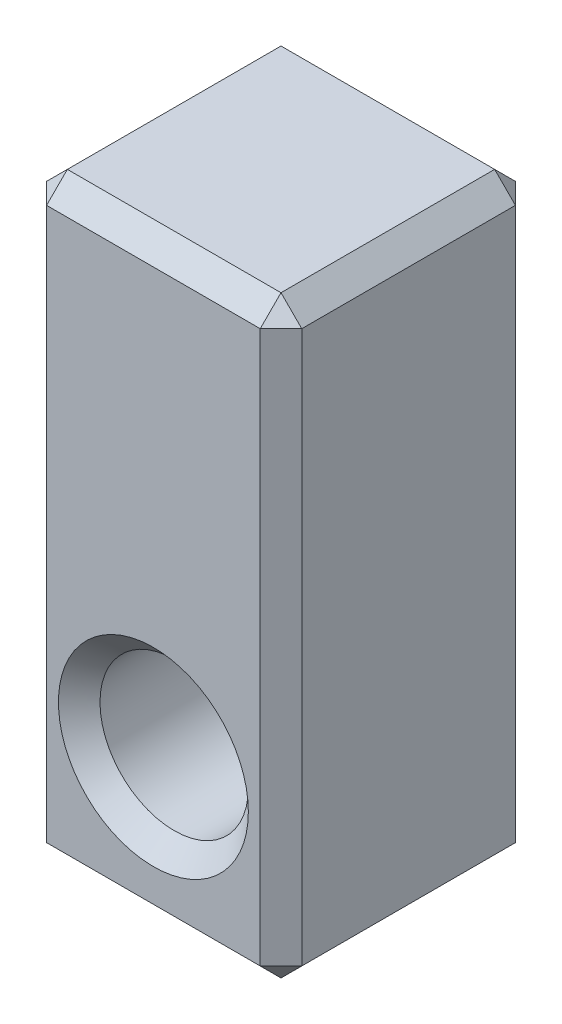
ISO-10303-21;
HEADER;
FILE_DESCRIPTION(('STEP AP214'),'2;1');
FILE_NAME('part.step','',(''),(''),'','','');
FILE_SCHEMA(('AUTOMOTIVE_DESIGN { 1 0 10303 214 1 1 1 1 }'));
ENDSEC;
DATA;
#1=APPLICATION_CONTEXT('core data for automotive mechanical design processes');
#2=APPLICATION_PROTOCOL_DEFINITION('international standard','automotive_design',2000,#1);
#3=PRODUCT_CONTEXT('',#1,'mechanical');
#4=PRODUCT('Part','Part','',(#3));
#5=PRODUCT_RELATED_PRODUCT_CATEGORY('part','',(#4));
#6=PRODUCT_DEFINITION_FORMATION('','',#4);
#7=PRODUCT_DEFINITION_CONTEXT('part definition',#1,'design');
#8=PRODUCT_DEFINITION('design','',#6,#7);
#9=PRODUCT_DEFINITION_SHAPE('','',#8);
#10=(LENGTH_UNIT() NAMED_UNIT(*) SI_UNIT(.MILLI.,.METRE.));
#11=(NAMED_UNIT(*) PLANE_ANGLE_UNIT() SI_UNIT($,.RADIAN.));
#12=(NAMED_UNIT(*) SI_UNIT($,.STERADIAN.) SOLID_ANGLE_UNIT());
#13=UNCERTAINTY_MEASURE_WITH_UNIT(LENGTH_MEASURE(1.E-05),#10,'distance_accuracy_value','');
#14=(GEOMETRIC_REPRESENTATION_CONTEXT(3) GLOBAL_UNCERTAINTY_ASSIGNED_CONTEXT((#13)) GLOBAL_UNIT_ASSIGNED_CONTEXT((#10,
#11,#12)) REPRESENTATION_CONTEXT('',''));
#15=CARTESIAN_POINT('',(0.,0.,0.));
#16=DIRECTION('',(0.,0.,1.));
#17=DIRECTION('',(1.,0.,0.));
#18=AXIS2_PLACEMENT_3D('',#15,#16,#17);
#19=CARTESIAN_POINT('',(-19.7305283018868,50.8,-21.306945754717));
#20=DIRECTION('',(0.,0.,1.));
#21=DIRECTION('',(1.,0.,0.));
#22=AXIS2_PLACEMENT_3D('',#19,#20,#21);
#23=PLANE('',#22);
#24=CARTESIAN_POINT('',(-30.6525283018868,12.7,-21.306945754717));
#25=DIRECTION('',(0.,0.,1.));
#26=DIRECTION('',(1.,0.,0.));
#27=AXIS2_PLACEMENT_3D('',#24,#25,#26);
#28=CIRCLE('',#27,8.128);
#29=CARTESIAN_POINT('',(-22.5245283018868,12.7,-21.306945754717));
#30=VERTEX_POINT('',#29);
#31=EDGE_CURVE('E191',#30,#30,#28,.T.);
#32=ORIENTED_EDGE('',*,*,#31,.T.);
#33=EDGE_LOOP('',(#32));
#34=FACE_BOUND('',#33,.T.);
#35=DIRECTION('',(0.,-1.,0.));
#36=VECTOR('',#35,1.);
#37=CARTESIAN_POINT('',(-21.5085283018868,50.8,-21.306945754717));
#38=LINE('',#37,#36);
#39=CARTESIAN_POINT('',(-21.5085283018868,49.022,-21.306945754717));
#40=VERTEX_POINT('',#39);
#41=CARTESIAN_POINT('',(-21.5085283018868,1.778,-21.306945754717));
#42=VERTEX_POINT('',#41);
#43=EDGE_CURVE('E184',#40,#42,#38,.T.);
#44=ORIENTED_EDGE('',*,*,#43,.T.);
#45=DIRECTION('',(-1.,0.,0.));
#46=VECTOR('',#45,1.);
#47=CARTESIAN_POINT('',(-19.7305283018868,1.778,-21.306945754717));
#48=LINE('',#47,#46);
#49=CARTESIAN_POINT('',(-39.7965283018868,1.778,-21.306945754717));
#50=VERTEX_POINT('',#49);
#51=EDGE_CURVE('E187',#42,#50,#48,.T.);
#52=ORIENTED_EDGE('',*,*,#51,.T.);
#53=DIRECTION('',(0.,1.,0.));
#54=VECTOR('',#53,1.);
#55=CARTESIAN_POINT('',(-39.7965283018868,50.8,-21.306945754717));
#56=LINE('',#55,#54);
#57=CARTESIAN_POINT('',(-39.7965283018868,49.022,-21.306945754717));
#58=VERTEX_POINT('',#57);
#59=EDGE_CURVE('E174',#50,#58,#56,.T.);
#60=ORIENTED_EDGE('',*,*,#59,.T.);
#61=DIRECTION('',(1.,0.,0.));
#62=VECTOR('',#61,1.);
#63=CARTESIAN_POINT('',(-19.7305283018868,49.022,-21.306945754717));
#64=LINE('',#63,#62);
#65=EDGE_CURVE('E181',#58,#40,#64,.T.);
#66=ORIENTED_EDGE('',*,*,#65,.T.);
#67=EDGE_LOOP('',(#44,#52,#60,#66));
#68=FACE_BOUND('',#67,.T.);
#69=ADVANCED_FACE('F41',(#34,#68),#23,.F.);
#70=CARTESIAN_POINT('',(-41.5745283018868,50.8,-21.306945754717));
#71=DIRECTION('',(1.,0.,0.));
#72=DIRECTION('',(0.,0.,-1.));
#73=AXIS2_PLACEMENT_3D('',#70,#71,#72);
#74=PLANE('',#73);
#75=DIRECTION('',(0.,-1.,0.));
#76=VECTOR('',#75,1.);
#77=CARTESIAN_POINT('',(-41.5745283018868,50.8,-19.528945754717));
#78=LINE('',#77,#76);
#79=CARTESIAN_POINT('',(-41.5745283018868,49.022,-19.528945754717));
#80=VERTEX_POINT('',#79);
#81=CARTESIAN_POINT('',(-41.5745283018868,1.77799999999999,-19.528945754717));
#82=VERTEX_POINT('',#81);
#83=EDGE_CURVE('E232',#80,#82,#78,.T.);
#84=ORIENTED_EDGE('',*,*,#83,.T.);
#85=DIRECTION('',(0.,0.,1.));
#86=VECTOR('',#85,1.);
#87=CARTESIAN_POINT('',(-41.5745283018868,1.77799999999999,-21.306945754717));
#88=LINE('',#87,#86);
#89=CARTESIAN_POINT('',(-41.5745283018868,1.77799999999999,-1.24094575471698));
#90=VERTEX_POINT('',#89);
#91=EDGE_CURVE('E11',#82,#90,#88,.T.);
#92=ORIENTED_EDGE('',*,*,#91,.T.);
#93=DIRECTION('',(0.,1.,0.));
#94=VECTOR('',#93,1.);
#95=CARTESIAN_POINT('',(-41.5745283018868,50.8,-1.24094575471698));
#96=LINE('',#95,#94);
#97=CARTESIAN_POINT('',(-41.5745283018868,49.022,-1.24094575471698));
#98=VERTEX_POINT('',#97);
#99=EDGE_CURVE('E52',#90,#98,#96,.T.);
#100=ORIENTED_EDGE('',*,*,#99,.T.);
#101=DIRECTION('',(0.,0.,-1.));
#102=VECTOR('',#101,1.);
#103=CARTESIAN_POINT('',(-41.5745283018868,49.022,-21.306945754717));
#104=LINE('',#103,#102);
#105=EDGE_CURVE('E235',#98,#80,#104,.T.);
#106=ORIENTED_EDGE('',*,*,#105,.T.);
#107=EDGE_LOOP('',(#84,#92,#100,#106));
#108=FACE_BOUND('',#107,.T.);
#109=ADVANCED_FACE('F362',(#108),#74,.F.);
#110=CARTESIAN_POINT('',(-41.5745283018868,50.8,0.537054245283015));
#111=DIRECTION('',(0.,0.,-1.));
#112=DIRECTION('',(-1.,0.,0.));
#113=AXIS2_PLACEMENT_3D('',#110,#111,#112);
#114=PLANE('',#113);
#115=CARTESIAN_POINT('',(-30.6525283018868,12.7,0.537054245283015));
#116=DIRECTION('',(0.,0.,-1.));
#117=DIRECTION('',(-1.,0.,0.));
#118=AXIS2_PLACEMENT_3D('',#115,#116,#117);
#119=CIRCLE('',#118,8.12799999999999);
#120=CARTESIAN_POINT('',(-22.5245283018868,12.7,0.537054245283015));
#121=VERTEX_POINT('',#120);
#122=EDGE_CURVE('E169',#121,#121,#119,.T.);
#123=ORIENTED_EDGE('',*,*,#122,.T.);
#124=EDGE_LOOP('',(#123));
#125=FACE_BOUND('',#124,.T.);
#126=DIRECTION('',(0.,1.,0.));
#127=VECTOR('',#126,1.);
#128=CARTESIAN_POINT('',(-21.5085283018868,50.8,0.537054245283015));
#129=LINE('',#128,#127);
#130=CARTESIAN_POINT('',(-21.5085283018868,1.77799999999999,0.537054245283015));
#131=VERTEX_POINT('',#130);
#132=CARTESIAN_POINT('',(-21.5085283018868,49.022,0.537054245283015));
#133=VERTEX_POINT('',#132);
#134=EDGE_CURVE('E166',#131,#133,#129,.T.);
#135=ORIENTED_EDGE('',*,*,#134,.T.);
#136=DIRECTION('',(-1.,0.,0.));
#137=VECTOR('',#136,1.);
#138=CARTESIAN_POINT('',(-41.5745283018868,49.022,0.537054245283015));
#139=LINE('',#138,#137);
#140=CARTESIAN_POINT('',(-39.7965283018868,49.022,0.537054245283015));
#141=VERTEX_POINT('',#140);
#142=EDGE_CURVE('E137',#133,#141,#139,.T.);
#143=ORIENTED_EDGE('',*,*,#142,.T.);
#144=DIRECTION('',(0.,-1.,0.));
#145=VECTOR('',#144,1.);
#146=CARTESIAN_POINT('',(-39.7965283018868,50.8,0.537054245283015));
#147=LINE('',#146,#145);
#148=CARTESIAN_POINT('',(-39.7965283018868,1.77799999999999,0.537054245283015));
#149=VERTEX_POINT('',#148);
#150=EDGE_CURVE('E155',#141,#149,#147,.T.);
#151=ORIENTED_EDGE('',*,*,#150,.T.);
#152=DIRECTION('',(1.,0.,0.));
#153=VECTOR('',#152,1.);
#154=CARTESIAN_POINT('',(-41.5745283018868,1.77799999999999,0.537054245283015));
#155=LINE('',#154,#153);
#156=EDGE_CURVE('E161',#149,#131,#155,.T.);
#157=ORIENTED_EDGE('',*,*,#156,.T.);
#158=EDGE_LOOP('',(#135,#143,#151,#157));
#159=FACE_BOUND('',#158,.T.);
#160=ADVANCED_FACE('F164',(#125,#159),#114,.F.);
#161=CARTESIAN_POINT('',(-19.7305283018868,50.8,0.537054245283015));
#162=DIRECTION('',(-1.,0.,0.));
#163=DIRECTION('',(0.,0.,1.));
#164=AXIS2_PLACEMENT_3D('',#161,#162,#163);
#165=PLANE('',#164);
#166=DIRECTION('',(0.,1.,0.));
#167=VECTOR('',#166,1.);
#168=CARTESIAN_POINT('',(-19.7305283018868,50.8,-19.528945754717));
#169=LINE('',#168,#167);
#170=CARTESIAN_POINT('',(-19.7305283018868,1.77799999999999,-19.528945754717));
#171=VERTEX_POINT('',#170);
#172=CARTESIAN_POINT('',(-19.7305283018868,49.022,-19.528945754717));
#173=VERTEX_POINT('',#172);
#174=EDGE_CURVE('E206',#171,#173,#169,.T.);
#175=ORIENTED_EDGE('',*,*,#174,.T.);
#176=DIRECTION('',(0.,0.,1.));
#177=VECTOR('',#176,1.);
#178=CARTESIAN_POINT('',(-19.7305283018868,49.022,0.537054245283015));
#179=LINE('',#178,#177);
#180=CARTESIAN_POINT('',(-19.7305283018868,49.022,-1.24094575471698));
#181=VERTEX_POINT('',#180);
#182=EDGE_CURVE('E215',#173,#181,#179,.T.);
#183=ORIENTED_EDGE('',*,*,#182,.T.);
#184=DIRECTION('',(0.,-1.,0.));
#185=VECTOR('',#184,1.);
#186=CARTESIAN_POINT('',(-19.7305283018868,50.8,-1.24094575471698));
#187=LINE('',#186,#185);
#188=CARTESIAN_POINT('',(-19.7305283018868,1.77799999999999,-1.24094575471698));
#189=VERTEX_POINT('',#188);
#190=EDGE_CURVE('E212',#181,#189,#187,.T.);
#191=ORIENTED_EDGE('',*,*,#190,.T.);
#192=DIRECTION('',(0.,0.,-1.));
#193=VECTOR('',#192,1.);
#194=CARTESIAN_POINT('',(-19.7305283018868,1.77799999999999,0.537054245283015));
#195=LINE('',#194,#193);
#196=EDGE_CURVE('E209',#189,#171,#195,.T.);
#197=ORIENTED_EDGE('',*,*,#196,.T.);
#198=EDGE_LOOP('',(#175,#183,#191,#197));
#199=FACE_BOUND('',#198,.T.);
#200=ADVANCED_FACE('F545',(#199),#165,.F.);
#201=CARTESIAN_POINT('',(0.,50.8,0.));
#202=DIRECTION('',(0.,1.,0.));
#203=DIRECTION('',(0.,0.,1.));
#204=AXIS2_PLACEMENT_3D('',#201,#202,#203);
#205=PLANE('',#204);
#206=DIRECTION('',(0.,0.,1.));
#207=VECTOR('',#206,1.);
#208=CARTESIAN_POINT('',(-39.7965283018868,50.8,0.537054245283015));
#209=LINE('',#208,#207);
#210=CARTESIAN_POINT('',(-39.7965283018868,50.8,-19.528945754717));
#211=VERTEX_POINT('',#210);
#212=CARTESIAN_POINT('',(-39.7965283018868,50.8,-1.24094575471698));
#213=VERTEX_POINT('',#212);
#214=EDGE_CURVE('E195',#211,#213,#209,.T.);
#215=ORIENTED_EDGE('',*,*,#214,.T.);
#216=DIRECTION('',(1.,0.,0.));
#217=VECTOR('',#216,1.);
#218=CARTESIAN_POINT('',(-19.7305283018868,50.8,-1.24094575471698));
#219=LINE('',#218,#217);
#220=CARTESIAN_POINT('',(-21.5085283018868,50.8,-1.24094575471698));
#221=VERTEX_POINT('',#220);
#222=EDGE_CURVE('E140',#213,#221,#219,.T.);
#223=ORIENTED_EDGE('',*,*,#222,.T.);
#224=DIRECTION('',(0.,0.,-1.));
#225=VECTOR('',#224,1.);
#226=CARTESIAN_POINT('',(-21.5085283018868,50.8,-21.306945754717));
#227=LINE('',#226,#225);
#228=CARTESIAN_POINT('',(-21.5085283018868,50.8,-19.528945754717));
#229=VERTEX_POINT('',#228);
#230=EDGE_CURVE('E201',#221,#229,#227,.T.);
#231=ORIENTED_EDGE('',*,*,#230,.T.);
#232=DIRECTION('',(-1.,0.,0.));
#233=VECTOR('',#232,1.);
#234=CARTESIAN_POINT('',(-41.5745283018868,50.8,-19.528945754717));
#235=LINE('',#234,#233);
#236=EDGE_CURVE('E198',#229,#211,#235,.T.);
#237=ORIENTED_EDGE('',*,*,#236,.T.);
#238=EDGE_LOOP('',(#215,#223,#231,#237));
#239=FACE_BOUND('',#238,.T.);
#240=ADVANCED_FACE('F355',(#239),#205,.T.);
#241=CARTESIAN_POINT('',(0.,0.,0.));
#242=DIRECTION('',(0.,1.,0.));
#243=DIRECTION('',(0.,0.,1.));
#244=AXIS2_PLACEMENT_3D('',#241,#242,#243);
#245=PLANE('',#244);
#246=DIRECTION('',(0.,0.,-1.));
#247=VECTOR('',#246,1.);
#248=CARTESIAN_POINT('',(-39.7965283018868,0.,0.));
#249=LINE('',#248,#247);
#250=CARTESIAN_POINT('',(-39.7965283018868,0.,-1.24094575471699));
#251=VERTEX_POINT('',#250);
#252=CARTESIAN_POINT('',(-39.7965283018868,0.,-19.528945754717));
#253=VERTEX_POINT('',#252);
#254=EDGE_CURVE('E225',#251,#253,#249,.T.);
#255=ORIENTED_EDGE('',*,*,#254,.T.);
#256=DIRECTION('',(1.,0.,0.));
#257=VECTOR('',#256,1.);
#258=CARTESIAN_POINT('',(0.,0.,-19.528945754717));
#259=LINE('',#258,#257);
#260=CARTESIAN_POINT('',(-21.5085283018868,0.,-19.528945754717));
#261=VERTEX_POINT('',#260);
#262=EDGE_CURVE('E228',#253,#261,#259,.T.);
#263=ORIENTED_EDGE('',*,*,#262,.T.);
#264=DIRECTION('',(0.,0.,1.));
#265=VECTOR('',#264,1.);
#266=CARTESIAN_POINT('',(-21.5085283018868,0.,0.));
#267=LINE('',#266,#265);
#268=CARTESIAN_POINT('',(-21.5085283018868,0.,-1.24094575471699));
#269=VERTEX_POINT('',#268);
#270=EDGE_CURVE('E219',#261,#269,#267,.T.);
#271=ORIENTED_EDGE('',*,*,#270,.T.);
#272=DIRECTION('',(-1.,0.,0.));
#273=VECTOR('',#272,1.);
#274=CARTESIAN_POINT('',(0.,0.,-1.24094575471699));
#275=LINE('',#274,#273);
#276=EDGE_CURVE('E222',#269,#251,#275,.T.);
#277=ORIENTED_EDGE('',*,*,#276,.T.);
#278=EDGE_LOOP('',(#255,#263,#271,#277));
#279=FACE_BOUND('',#278,.T.);
#280=ADVANCED_FACE('F385',(#279),#245,.F.);
#281=CARTESIAN_POINT('',(-30.6525283018868,12.7,-21.306945754717));
#282=DIRECTION('',(0.,0.,1.));
#283=DIRECTION('',(1.,0.,0.));
#284=AXIS2_PLACEMENT_3D('',#281,#282,#283);
#285=CYLINDRICAL_SURFACE('',#284,6.35);
#286=CARTESIAN_POINT('',(-30.6525283018868,12.7,-1.24094575471697));
#287=DIRECTION('',(0.,0.,-1.));
#288=DIRECTION('',(-1.,0.,0.));
#289=AXIS2_PLACEMENT_3D('',#286,#287,#288);
#290=CIRCLE('',#289,6.35);
#291=CARTESIAN_POINT('',(-24.3025283018868,12.7,-1.24094575471697));
#292=VERTEX_POINT('',#291);
#293=EDGE_CURVE('E162',#292,#292,#290,.F.);
#294=ORIENTED_EDGE('',*,*,#293,.T.);
#295=EDGE_LOOP('',(#294));
#296=FACE_BOUND('',#295,.T.);
#297=CARTESIAN_POINT('',(-30.6525283018868,12.7,-19.528945754717));
#298=DIRECTION('',(0.,0.,1.));
#299=DIRECTION('',(1.,0.,0.));
#300=AXIS2_PLACEMENT_3D('',#297,#298,#299);
#301=CIRCLE('',#300,6.35);
#302=CARTESIAN_POINT('',(-24.3025283018868,12.7,-19.528945754717));
#303=VERTEX_POINT('',#302);
#304=EDGE_CURVE('E319',#303,#303,#301,.F.);
#305=ORIENTED_EDGE('',*,*,#304,.T.);
#306=EDGE_LOOP('',(#305));
#307=FACE_BOUND('',#306,.T.);
#308=ADVANCED_FACE('F421',(#296,#307),#285,.F.);
#309=CARTESIAN_POINT('',(-30.6525283018868,12.7,-1.24094575471697));
#310=DIRECTION('',(0.,0.,1.));
#311=DIRECTION('',(1.,0.,0.));
#312=AXIS2_PLACEMENT_3D('',#309,#310,#311);
#313=CONICAL_SURFACE('',#312,6.35,0.785398163397448);
#314=CARTESIAN_POINT('',(-22.5245283018868,12.7,0.537054245283015));
#315=CARTESIAN_POINT('',(-22.5430491352201,12.7,0.518533411949682));
#316=CARTESIAN_POINT('',(-22.5615699685535,12.7,0.500012578616349));
#317=CARTESIAN_POINT('',(-22.5986116352201,12.7,0.462970911949682));
#318=CARTESIAN_POINT('',(-22.6171324685535,12.7,0.444450078616349));
#319=CARTESIAN_POINT('',(-22.6541741352201,12.7,0.407408411949682));
#320=CARTESIAN_POINT('',(-22.6726949685535,12.7,0.388887578616349));
#321=CARTESIAN_POINT('',(-22.7097366352201,12.7,0.351845911949683));
#322=CARTESIAN_POINT('',(-22.7282574685535,12.7,0.33332507861635));
#323=CARTESIAN_POINT('',(-22.7652991352201,12.7,0.296283411949684));
#324=CARTESIAN_POINT('',(-22.7838199685535,12.7,0.27776257861635));
#325=CARTESIAN_POINT('',(-22.8208616352201,12.7,0.240720911949683));
#326=CARTESIAN_POINT('',(-22.8393824685535,12.7,0.22220007861635));
#327=CARTESIAN_POINT('',(-22.8764241352201,12.7,0.185158411949684));
#328=CARTESIAN_POINT('',(-22.8949449685535,12.7,0.166637578616351));
#329=CARTESIAN_POINT('',(-22.9319866352201,12.7,0.129595911949685));
#330=CARTESIAN_POINT('',(-22.9505074685535,12.7,0.111075078616351));
#331=CARTESIAN_POINT('',(-22.9875491352201,12.7,0.0740334119496846));
#332=CARTESIAN_POINT('',(-23.0060699685535,12.7,0.0555125786163512));
#333=CARTESIAN_POINT('',(-23.0431116352201,12.7,0.0184709119496849));
#334=CARTESIAN_POINT('',(-23.0616324685535,12.7,-4.9921383647878E-05));
#335=CARTESIAN_POINT('',(-23.0986741352201,12.7,-0.0370915880503141));
#336=CARTESIAN_POINT('',(-23.1171949685534,12.7,-0.0556124213836475));
#337=CARTESIAN_POINT('',(-23.1542366352201,12.7,-0.0926540880503143));
#338=CARTESIAN_POINT('',(-23.1727574685534,12.7,-0.111174921383648));
#339=CARTESIAN_POINT('',(-23.2097991352201,12.7,-0.148216588050314));
#340=CARTESIAN_POINT('',(-23.2283199685534,12.7,-0.166737421383647));
#341=CARTESIAN_POINT('',(-23.2653616352201,12.7,-0.203779088050313));
#342=CARTESIAN_POINT('',(-23.2838824685534,12.7,-0.222299921383646));
#343=CARTESIAN_POINT('',(-23.3209241352201,12.7,-0.259341588050313));
#344=CARTESIAN_POINT('',(-23.3394449685534,12.7,-0.277862421383647));
#345=CARTESIAN_POINT('',(-23.3764866352201,12.7,-0.314904088050313));
#346=CARTESIAN_POINT('',(-23.3950074685534,12.7,-0.333424921383646));
#347=CARTESIAN_POINT('',(-23.4320491352201,12.7,-0.370466588050312));
#348=CARTESIAN_POINT('',(-23.4505699685534,12.7,-0.388987421383645));
#349=CARTESIAN_POINT('',(-23.4876116352201,12.7,-0.426029088050312));
#350=CARTESIAN_POINT('',(-23.5061324685534,12.7,-0.444549921383646));
#351=CARTESIAN_POINT('',(-23.5431741352201,12.7,-0.481591588050312));
#352=CARTESIAN_POINT('',(-23.5616949685534,12.7,-0.500112421383645));
#353=CARTESIAN_POINT('',(-23.5987366352201,12.7,-0.537154088050311));
#354=CARTESIAN_POINT('',(-23.6172574685534,12.7,-0.555674921383645));
#355=CARTESIAN_POINT('',(-23.6542991352201,12.7,-0.592716588050311));
#356=CARTESIAN_POINT('',(-23.6728199685534,12.7,-0.611237421383644));
#357=CARTESIAN_POINT('',(-23.7098616352201,12.7,-0.64827908805031));
#358=CARTESIAN_POINT('',(-23.7283824685534,12.7,-0.666799921383644));
#359=CARTESIAN_POINT('',(-23.7654241352201,12.7,-0.70384158805031));
#360=CARTESIAN_POINT('',(-23.7839449685534,12.7,-0.722362421383643));
#361=CARTESIAN_POINT('',(-23.8209866352201,12.7,-0.759404088050309));
#362=CARTESIAN_POINT('',(-23.8395074685534,12.7,-0.777924921383643));
#363=CARTESIAN_POINT('',(-23.8765491352201,12.7,-0.814966588050309));
#364=CARTESIAN_POINT('',(-23.8950699685534,12.7,-0.833487421383643));
#365=CARTESIAN_POINT('',(-23.9321116352201,12.7,-0.870529088050309));
#366=CARTESIAN_POINT('',(-23.9506324685534,12.7,-0.889049921383642));
#367=CARTESIAN_POINT('',(-23.9876741352201,12.7,-0.926091588050308));
#368=CARTESIAN_POINT('',(-24.0061949685534,12.7,-0.944612421383641));
#369=CARTESIAN_POINT('',(-24.0432366352201,12.7,-0.981654088050308));
#370=CARTESIAN_POINT('',(-24.0617574685534,12.7,-1.00017492138364));
#371=CARTESIAN_POINT('',(-24.0987991352201,12.7,-1.03721658805031));
#372=CARTESIAN_POINT('',(-24.1173199685534,12.7,-1.05573742138364));
#373=CARTESIAN_POINT('',(-24.1543616352201,12.7,-1.09277908805031));
#374=CARTESIAN_POINT('',(-24.1728824685534,12.7,-1.11129992138364));
#375=CARTESIAN_POINT('',(-24.2099241352201,12.7,-1.14834158805031));
#376=CARTESIAN_POINT('',(-24.2284449685534,12.7,-1.16686242138364));
#377=CARTESIAN_POINT('',(-24.2654866352201,12.7,-1.20390408805031));
#378=CARTESIAN_POINT('',(-24.2840074685534,12.7,-1.22242492138364));
#379=CARTESIAN_POINT('',(-24.3025283018868,12.7,-1.24094575471697));
#380=B_SPLINE_CURVE_WITH_KNOTS('',3,(#314,#315,#316,#317,#318,#319,#320,#321,#322,#323,#324,
#325,#326,#327,#328,#329,#330,#331,#332,#333,#334,#335,#336,#337,#338,#339,#340,#341,#342,#343,
#344,#345,#346,#347,#348,#349,#350,#351,#352,#353,#354,#355,#356,#357,#358,#359,#360,#361,#362,
#363,#364,#365,#366,#367,#368,#369,#370,#371,#372,#373,#374,#375,#376,#377,#378,#379),
.UNSPECIFIED.,.F.,.F.,(4,2,2,2,2,2,2,2,2,2,2,2,2,2,2,2,2,2,2,2,2,2,2,2,2,2,2,2,2,2,2,2,4),(0.,
0.0785772410593537,0.157154482118707,0.235731723178063,0.314308964237419,0.392886205296771,
0.471463446356127,0.550040687415483,0.628617928474837,0.70719516953419,0.785772410593546,
0.8643496516529,0.942926892712253,1.02150413377161,1.10008137483096,1.17865861589032,
1.25723585694967,1.33581309800903,1.41439033906838,1.49296758012774,1.57154482118709,
1.65012206224645,1.7286993033058,1.80727654436516,1.88585378542451,1.96443102648386,
2.04300826754322,2.12158550860257,2.20016274966193,2.27873999072128,2.35731723178064,
2.43589447283999,2.51447171389935),.UNSPECIFIED.);
#381=EDGE_CURVE('BSEAM414',#121,#292,#380,.T.);
#382=ORIENTED_EDGE('',*,*,#122,.F.);
#383=ORIENTED_EDGE('',*,*,#293,.F.);
#384=ORIENTED_EDGE('',*,*,#381,.T.);
#385=ORIENTED_EDGE('',*,*,#381,.F.);
#386=EDGE_LOOP('',(#382,#384,#383,#385));
#387=FACE_BOUND('',#386,.T.);
#388=ADVANCED_FACE('F414',(#387),#313,.F.);
#389=CARTESIAN_POINT('',(-30.6525283018868,12.7,-21.306945754717));
#390=DIRECTION('',(0.,0.,-1.));
#391=DIRECTION('',(-1.,0.,0.));
#392=AXIS2_PLACEMENT_3D('',#389,#390,#391);
#393=CONICAL_SURFACE('',#392,8.128,0.785398163397446);
#394=ORIENTED_EDGE('',*,*,#304,.F.);
#395=EDGE_LOOP('',(#394));
#396=FACE_BOUND('',#395,.T.);
#397=ORIENTED_EDGE('',*,*,#31,.F.);
#398=EDGE_LOOP('',(#397));
#399=FACE_BOUND('',#398,.T.);
#400=ADVANCED_FACE('F420',(#396,#399),#393,.F.);
#401=CARTESIAN_POINT('',(-19.7305283018868,1.778,-21.306945754717));
#402=DIRECTION('',(0.,0.707106781186546,0.707106781186549));
#403=DIRECTION('',(-1.,0.,0.));
#404=AXIS2_PLACEMENT_3D('',#401,#402,#403);
#405=PLANE('',#404);
#406=DIRECTION('',(0.,0.707106781186549,-0.707106781186546));
#407=VECTOR('',#406,1.);
#408=CARTESIAN_POINT('',(-39.7965283018868,1.778,-21.306945754717));
#409=LINE('',#408,#407);
#410=EDGE_CURVE('E46',#50,#253,#409,.F.);
#411=ORIENTED_EDGE('',*,*,#410,.F.);
#412=ORIENTED_EDGE('',*,*,#51,.F.);
#413=DIRECTION('',(0.,-0.707106781186549,0.707106781186546));
#414=VECTOR('',#413,1.);
#415=CARTESIAN_POINT('',(-21.5085283018868,0.,-19.528945754717));
#416=LINE('',#415,#414);
#417=EDGE_CURVE('E310',#261,#42,#416,.F.);
#418=ORIENTED_EDGE('',*,*,#417,.F.);
#419=ORIENTED_EDGE('',*,*,#262,.F.);
#420=EDGE_LOOP('',(#411,#412,#418,#419));
#421=FACE_BOUND('',#420,.T.);
#422=ADVANCED_FACE('F44',(#421),#405,.F.);
#423=CARTESIAN_POINT('',(-39.7965283018868,1.778,-21.306945754717));
#424=DIRECTION('',(-0.577350269189624,-0.577350269189624,-0.577350269189629));
#425=DIRECTION('',(-0.70710678118655,0.,0.707106781186545));
#426=AXIS2_PLACEMENT_3D('',#423,#424,#425);
#427=PLANE('',#426);
#428=DIRECTION('',(-0.707106781186549,0.,0.707106781186546));
#429=VECTOR('',#428,1.);
#430=CARTESIAN_POINT('',(-39.7965283018868,1.778,-21.306945754717));
#431=LINE('',#430,#429);
#432=EDGE_CURVE('E303',#50,#82,#431,.T.);
#433=ORIENTED_EDGE('',*,*,#432,.F.);
#434=ORIENTED_EDGE('',*,*,#410,.T.);
#435=DIRECTION('',(0.707106781186547,-0.707106781186547,0.));
#436=VECTOR('',#435,1.);
#437=CARTESIAN_POINT('',(-40.6855283018868,0.888999999999997,-19.528945754717));
#438=LINE('',#437,#436);
#439=EDGE_CURVE('E307',#82,#253,#438,.T.);
#440=ORIENTED_EDGE('',*,*,#439,.F.);
#441=EDGE_LOOP('',(#433,#434,#440));
#442=FACE_BOUND('',#441,.T.);
#443=ADVANCED_FACE('F508',(#442),#427,.T.);
#444=CARTESIAN_POINT('',(-21.5085283018868,0.,-19.528945754717));
#445=DIRECTION('',(0.577350269189624,-0.577350269189626,-0.577350269189628));
#446=DIRECTION('',(0.,0.707106781186549,-0.707106781186546));
#447=AXIS2_PLACEMENT_3D('',#444,#445,#446);
#448=PLANE('',#447);
#449=DIRECTION('',(0.707106781186549,0.707106781186546,0.));
#450=VECTOR('',#449,1.);
#451=CARTESIAN_POINT('',(-21.5085283018868,0.,-19.528945754717));
#452=LINE('',#451,#450);
#453=EDGE_CURVE('E295',#261,#171,#452,.T.);
#454=ORIENTED_EDGE('',*,*,#453,.F.);
#455=ORIENTED_EDGE('',*,*,#417,.T.);
#456=DIRECTION('',(-0.707106781186549,0.,-0.707106781186546));
#457=VECTOR('',#456,1.);
#458=CARTESIAN_POINT('',(-20.6195283018868,1.778,-20.417945754717));
#459=LINE('',#458,#457);
#460=EDGE_CURVE('E299',#171,#42,#459,.T.);
#461=ORIENTED_EDGE('',*,*,#460,.F.);
#462=EDGE_LOOP('',(#454,#455,#461));
#463=FACE_BOUND('',#462,.T.);
#464=ADVANCED_FACE('F379',(#463),#448,.T.);
#465=CARTESIAN_POINT('',(-41.5745283018868,1.77799999999999,-21.306945754717));
#466=DIRECTION('',(0.707106781186548,0.707106781186547,0.));
#467=DIRECTION('',(0.,0.,1.));
#468=AXIS2_PLACEMENT_3D('',#465,#466,#467);
#469=PLANE('',#468);
#470=ORIENTED_EDGE('',*,*,#439,.T.);
#471=ORIENTED_EDGE('',*,*,#254,.F.);
#472=DIRECTION('',(-0.707106781186548,0.707106781186548,0.));
#473=VECTOR('',#472,1.);
#474=CARTESIAN_POINT('',(-41.5745283018868,1.77799999999999,-1.24094575471698));
#475=LINE('',#474,#473);
#476=EDGE_CURVE('E287',#90,#251,#475,.F.);
#477=ORIENTED_EDGE('',*,*,#476,.F.);
#478=ORIENTED_EDGE('',*,*,#91,.F.);
#479=EDGE_LOOP('',(#470,#471,#477,#478));
#480=FACE_BOUND('',#479,.T.);
#481=ADVANCED_FACE('F389',(#480),#469,.F.);
#482=CARTESIAN_POINT('',(-41.5745283018868,50.8,-19.528945754717));
#483=DIRECTION('',(0.707106781186546,0.,0.707106781186549));
#484=DIRECTION('',(0.,-1.,0.));
#485=AXIS2_PLACEMENT_3D('',#482,#483,#484);
#486=PLANE('',#485);
#487=ORIENTED_EDGE('',*,*,#432,.T.);
#488=ORIENTED_EDGE('',*,*,#83,.F.);
#489=DIRECTION('',(0.707106781186549,0.,-0.707106781186546));
#490=VECTOR('',#489,1.);
#491=CARTESIAN_POINT('',(-40.6855283018868,49.022,-20.417945754717));
#492=LINE('',#491,#490);
#493=EDGE_CURVE('E283',#58,#80,#492,.F.);
#494=ORIENTED_EDGE('',*,*,#493,.F.);
#495=ORIENTED_EDGE('',*,*,#59,.F.);
#496=EDGE_LOOP('',(#487,#488,#494,#495));
#497=FACE_BOUND('',#496,.T.);
#498=ADVANCED_FACE('F365',(#497),#486,.F.);
#499=CARTESIAN_POINT('',(0.,50.8,-19.528945754717));
#500=DIRECTION('',(0.,0.707106781186546,-0.707106781186549));
#501=DIRECTION('',(1.,0.,0.));
#502=AXIS2_PLACEMENT_3D('',#499,#500,#501);
#503=PLANE('',#502);
#504=DIRECTION('',(0.,0.707106781186549,0.707106781186546));
#505=VECTOR('',#504,1.);
#506=CARTESIAN_POINT('',(-21.5085283018868,50.8,-19.528945754717));
#507=LINE('',#506,#505);
#508=EDGE_CURVE('E275',#40,#229,#507,.T.);
#509=ORIENTED_EDGE('',*,*,#508,.F.);
#510=ORIENTED_EDGE('',*,*,#65,.F.);
#511=DIRECTION('',(0.,-0.707106781186549,-0.707106781186546));
#512=VECTOR('',#511,1.);
#513=CARTESIAN_POINT('',(-39.7965283018868,50.8,-19.528945754717));
#514=LINE('',#513,#512);
#515=EDGE_CURVE('E279',#211,#58,#514,.T.);
#516=ORIENTED_EDGE('',*,*,#515,.F.);
#517=ORIENTED_EDGE('',*,*,#236,.F.);
#518=EDGE_LOOP('',(#509,#510,#516,#517));
#519=FACE_BOUND('',#518,.T.);
#520=ADVANCED_FACE('F371',(#519),#503,.T.);
#521=CARTESIAN_POINT('',(-21.5085283018868,50.8,-21.306945754717));
#522=DIRECTION('',(-0.707106781186546,0.,0.707106781186549));
#523=DIRECTION('',(0.,-1.,0.));
#524=AXIS2_PLACEMENT_3D('',#521,#522,#523);
#525=PLANE('',#524);
#526=ORIENTED_EDGE('',*,*,#460,.T.);
#527=ORIENTED_EDGE('',*,*,#43,.F.);
#528=DIRECTION('',(0.707106781186549,0.,0.707106781186546));
#529=VECTOR('',#528,1.);
#530=CARTESIAN_POINT('',(-20.6195283018868,49.022,-20.417945754717));
#531=LINE('',#530,#529);
#532=EDGE_CURVE('E271',#173,#40,#531,.F.);
#533=ORIENTED_EDGE('',*,*,#532,.F.);
#534=ORIENTED_EDGE('',*,*,#174,.F.);
#535=EDGE_LOOP('',(#526,#527,#533,#534));
#536=FACE_BOUND('',#535,.T.);
#537=ADVANCED_FACE('F377',(#536),#525,.F.);
#538=CARTESIAN_POINT('',(-19.7305283018868,1.77799999999999,0.537054245283015));
#539=DIRECTION('',(-0.707106781186546,0.707106781186549,0.));
#540=DIRECTION('',(0.,0.,-1.));
#541=AXIS2_PLACEMENT_3D('',#538,#539,#540);
#542=PLANE('',#541);
#543=ORIENTED_EDGE('',*,*,#453,.T.);
#544=ORIENTED_EDGE('',*,*,#196,.F.);
#545=DIRECTION('',(-0.707106781186549,-0.707106781186546,0.));
#546=VECTOR('',#545,1.);
#547=CARTESIAN_POINT('',(-19.7305283018868,1.77799999999999,-1.24094575471698));
#548=LINE('',#547,#546);
#549=EDGE_CURVE('E267',#269,#189,#548,.F.);
#550=ORIENTED_EDGE('',*,*,#549,.F.);
#551=ORIENTED_EDGE('',*,*,#270,.F.);
#552=EDGE_LOOP('',(#543,#544,#550,#551));
#553=FACE_BOUND('',#552,.T.);
#554=ADVANCED_FACE('F401',(#553),#542,.F.);
#555=CARTESIAN_POINT('',(-41.5745283018868,1.77799999999999,0.537054245283015));
#556=DIRECTION('',(0.,0.707106781186549,-0.707106781186546));
#557=DIRECTION('',(1.,0.,0.));
#558=AXIS2_PLACEMENT_3D('',#555,#556,#557);
#559=PLANE('',#558);
#560=DIRECTION('',(0.,-0.707106781186546,-0.707106781186549));
#561=VECTOR('',#560,1.);
#562=CARTESIAN_POINT('',(-39.7965283018868,0.888999999999994,-0.351945754716989));
#563=LINE('',#562,#561);
#564=EDGE_CURVE('E291',#251,#149,#563,.F.);
#565=ORIENTED_EDGE('',*,*,#564,.F.);
#566=ORIENTED_EDGE('',*,*,#276,.F.);
#567=DIRECTION('',(0.,0.707106781186546,0.707106781186549));
#568=VECTOR('',#567,1.);
#569=CARTESIAN_POINT('',(-21.5085283018868,0.888999999999997,-0.351945754716986));
#570=LINE('',#569,#568);
#571=EDGE_CURVE('E263',#131,#269,#570,.F.);
#572=ORIENTED_EDGE('',*,*,#571,.F.);
#573=ORIENTED_EDGE('',*,*,#156,.F.);
#574=EDGE_LOOP('',(#565,#566,#572,#573));
#575=FACE_BOUND('',#574,.T.);
#576=ADVANCED_FACE('F338',(#575),#559,.F.);
#577=CARTESIAN_POINT('',(-41.5745283018868,1.77799999999999,-1.24094575471698));
#578=DIRECTION('',(-0.577350269189624,-0.577350269189627,0.577350269189627));
#579=DIRECTION('',(0.,-0.707106781186547,-0.707106781186547));
#580=AXIS2_PLACEMENT_3D('',#577,#578,#579);
#581=PLANE('',#580);
#582=ORIENTED_EDGE('',*,*,#476,.T.);
#583=ORIENTED_EDGE('',*,*,#564,.T.);
#584=DIRECTION('',(0.707106781186549,0.,0.707106781186546));
#585=VECTOR('',#584,1.);
#586=CARTESIAN_POINT('',(-41.5745283018868,1.77799999999999,-1.24094575471698));
#587=LINE('',#586,#585);
#588=EDGE_CURVE('E157',#90,#149,#587,.T.);
#589=ORIENTED_EDGE('',*,*,#588,.F.);
#590=EDGE_LOOP('',(#582,#583,#589));
#591=FACE_BOUND('',#590,.T.);
#592=ADVANCED_FACE('F392',(#591),#581,.T.);
#593=CARTESIAN_POINT('',(-39.7965283018868,50.8,-19.528945754717));
#594=DIRECTION('',(-0.577350269189624,0.577350269189624,-0.577350269189629));
#595=DIRECTION('',(-0.70710678118655,0.,0.707106781186545));
#596=AXIS2_PLACEMENT_3D('',#593,#594,#595);
#597=PLANE('',#596);
#598=ORIENTED_EDGE('',*,*,#515,.T.);
#599=ORIENTED_EDGE('',*,*,#493,.T.);
#600=DIRECTION('',(0.707106781186547,0.707106781186547,0.));
#601=VECTOR('',#600,1.);
#602=CARTESIAN_POINT('',(-39.7965283018868,50.8,-19.528945754717));
#603=LINE('',#602,#601);
#604=EDGE_CURVE('E257',#211,#80,#603,.F.);
#605=ORIENTED_EDGE('',*,*,#604,.F.);
#606=EDGE_LOOP('',(#598,#599,#605));
#607=FACE_BOUND('',#606,.T.);
#608=ADVANCED_FACE('F367',(#607),#597,.T.);
#609=CARTESIAN_POINT('',(-21.5085283018868,50.8,-19.528945754717));
#610=DIRECTION('',(0.577350269189626,0.577350269189624,-0.577350269189628));
#611=DIRECTION('',(-0.707106781186549,0.,-0.707106781186546));
#612=AXIS2_PLACEMENT_3D('',#609,#610,#611);
#613=PLANE('',#612);
#614=ORIENTED_EDGE('',*,*,#532,.T.);
#615=ORIENTED_EDGE('',*,*,#508,.T.);
#616=DIRECTION('',(0.707106781186546,-0.707106781186549,0.));
#617=VECTOR('',#616,1.);
#618=CARTESIAN_POINT('',(-21.5085283018868,50.8,-19.528945754717));
#619=LINE('',#618,#617);
#620=EDGE_CURVE('E253',#173,#229,#619,.F.);
#621=ORIENTED_EDGE('',*,*,#620,.F.);
#622=EDGE_LOOP('',(#614,#615,#621));
#623=FACE_BOUND('',#622,.T.);
#624=ADVANCED_FACE('F399',(#623),#613,.T.);
#625=CARTESIAN_POINT('',(-19.7305283018868,1.77799999999999,-1.24094575471698));
#626=DIRECTION('',(0.577350269189624,-0.577350269189628,0.577350269189626));
#627=DIRECTION('',(0.,-0.707106781186546,-0.707106781186549));
#628=AXIS2_PLACEMENT_3D('',#625,#626,#627);
#629=PLANE('',#628);
#630=ORIENTED_EDGE('',*,*,#571,.T.);
#631=ORIENTED_EDGE('',*,*,#549,.T.);
#632=DIRECTION('',(0.707106781186549,0.,-0.707106781186546));
#633=VECTOR('',#632,1.);
#634=CARTESIAN_POINT('',(-19.7305283018868,1.77799999999999,-1.24094575471698));
#635=LINE('',#634,#633);
#636=EDGE_CURVE('E153',#131,#189,#635,.T.);
#637=ORIENTED_EDGE('',*,*,#636,.F.);
#638=EDGE_LOOP('',(#630,#631,#637));
#639=FACE_BOUND('',#638,.T.);
#640=ADVANCED_FACE('F341',(#639),#629,.T.);
#641=CARTESIAN_POINT('',(-39.7965283018868,50.8,0.537054245283015));
#642=DIRECTION('',(0.707106781186546,0.,-0.707106781186549));
#643=DIRECTION('',(0.,-1.,0.));
#644=AXIS2_PLACEMENT_3D('',#641,#642,#643);
#645=PLANE('',#644);
#646=ORIENTED_EDGE('',*,*,#588,.T.);
#647=ORIENTED_EDGE('',*,*,#150,.F.);
#648=DIRECTION('',(-0.707106781186549,0.,-0.707106781186546));
#649=VECTOR('',#648,1.);
#650=CARTESIAN_POINT('',(-39.7965283018868,49.022,0.537054245283015));
#651=LINE('',#650,#649);
#652=EDGE_CURVE('E147',#98,#141,#651,.F.);
#653=ORIENTED_EDGE('',*,*,#652,.F.);
#654=ORIENTED_EDGE('',*,*,#99,.F.);
#655=EDGE_LOOP('',(#646,#647,#653,#654));
#656=FACE_BOUND('',#655,.T.);
#657=ADVANCED_FACE('F156',(#656),#645,.F.);
#658=CARTESIAN_POINT('',(-39.7965283018868,50.8,0.));
#659=DIRECTION('',(-0.707106781186548,0.707106781186547,0.));
#660=DIRECTION('',(0.,0.,-1.));
#661=AXIS2_PLACEMENT_3D('',#658,#659,#660);
#662=PLANE('',#661);
#663=ORIENTED_EDGE('',*,*,#604,.T.);
#664=ORIENTED_EDGE('',*,*,#105,.F.);
#665=DIRECTION('',(-0.707106781186547,-0.707106781186548,0.));
#666=VECTOR('',#665,1.);
#667=CARTESIAN_POINT('',(-40.6855283018868,49.911,-1.24094575471698));
#668=LINE('',#667,#666);
#669=EDGE_CURVE('E151',#213,#98,#668,.T.);
#670=ORIENTED_EDGE('',*,*,#669,.F.);
#671=ORIENTED_EDGE('',*,*,#214,.F.);
#672=EDGE_LOOP('',(#663,#664,#670,#671));
#673=FACE_BOUND('',#672,.T.);
#674=ADVANCED_FACE('F359',(#673),#662,.T.);
#675=CARTESIAN_POINT('',(-21.5085283018868,50.8,0.));
#676=DIRECTION('',(0.707106781186549,0.707106781186546,0.));
#677=DIRECTION('',(0.,0.,1.));
#678=AXIS2_PLACEMENT_3D('',#675,#676,#677);
#679=PLANE('',#678);
#680=ORIENTED_EDGE('',*,*,#620,.T.);
#681=ORIENTED_EDGE('',*,*,#230,.F.);
#682=DIRECTION('',(-0.707106781186546,0.707106781186549,0.));
#683=VECTOR('',#682,1.);
#684=CARTESIAN_POINT('',(-21.5085283018868,50.8,-1.24094575471698));
#685=LINE('',#684,#683);
#686=EDGE_CURVE('E244',#181,#221,#685,.T.);
#687=ORIENTED_EDGE('',*,*,#686,.F.);
#688=ORIENTED_EDGE('',*,*,#182,.F.);
#689=EDGE_LOOP('',(#680,#681,#687,#688));
#690=FACE_BOUND('',#689,.T.);
#691=ADVANCED_FACE('F351',(#690),#679,.T.);
#692=CARTESIAN_POINT('',(-19.7305283018868,50.8,-1.24094575471698));
#693=DIRECTION('',(-0.707106781186546,0.,-0.707106781186549));
#694=DIRECTION('',(0.,-1.,0.));
#695=AXIS2_PLACEMENT_3D('',#692,#693,#694);
#696=PLANE('',#695);
#697=ORIENTED_EDGE('',*,*,#636,.T.);
#698=ORIENTED_EDGE('',*,*,#190,.F.);
#699=DIRECTION('',(-0.707106781186549,0.,0.707106781186546));
#700=VECTOR('',#699,1.);
#701=CARTESIAN_POINT('',(-20.6195283018868,49.022,-0.351945754716983));
#702=LINE('',#701,#700);
#703=EDGE_CURVE('E144',#133,#181,#702,.F.);
#704=ORIENTED_EDGE('',*,*,#703,.F.);
#705=ORIENTED_EDGE('',*,*,#134,.F.);
#706=EDGE_LOOP('',(#697,#698,#704,#705));
#707=FACE_BOUND('',#706,.T.);
#708=ADVANCED_FACE('F344',(#707),#696,.F.);
#709=CARTESIAN_POINT('',(-39.7965283018868,49.022,0.537054245283015));
#710=DIRECTION('',(-0.577350269189624,0.577350269189624,0.577350269189629));
#711=DIRECTION('',(0.,-0.70710678118655,0.707106781186545));
#712=AXIS2_PLACEMENT_3D('',#709,#710,#711);
#713=PLANE('',#712);
#714=ORIENTED_EDGE('',*,*,#669,.T.);
#715=ORIENTED_EDGE('',*,*,#652,.T.);
#716=DIRECTION('',(0.,0.707106781186549,-0.707106781186546));
#717=VECTOR('',#716,1.);
#718=CARTESIAN_POINT('',(-39.7965283018868,49.022,0.537054245283015));
#719=LINE('',#718,#717);
#720=EDGE_CURVE('E133',#213,#141,#719,.F.);
#721=ORIENTED_EDGE('',*,*,#720,.F.);
#722=EDGE_LOOP('',(#714,#715,#721));
#723=FACE_BOUND('',#722,.T.);
#724=ADVANCED_FACE('F149',(#723),#713,.T.);
#725=CARTESIAN_POINT('',(-21.5085283018868,50.8,-1.24094575471698));
#726=DIRECTION('',(0.577350269189626,0.577350269189624,0.577350269189628));
#727=DIRECTION('',(0.707106781186549,0.,-0.707106781186546));
#728=AXIS2_PLACEMENT_3D('',#725,#726,#727);
#729=PLANE('',#728);
#730=ORIENTED_EDGE('',*,*,#703,.T.);
#731=ORIENTED_EDGE('',*,*,#686,.T.);
#732=DIRECTION('',(0.,-0.707106781186549,0.707106781186546));
#733=VECTOR('',#732,1.);
#734=CARTESIAN_POINT('',(-21.5085283018868,50.8,-1.24094575471698));
#735=LINE('',#734,#733);
#736=EDGE_CURVE('E145',#133,#221,#735,.F.);
#737=ORIENTED_EDGE('',*,*,#736,.F.);
#738=EDGE_LOOP('',(#730,#731,#737));
#739=FACE_BOUND('',#738,.T.);
#740=ADVANCED_FACE('F347',(#739),#729,.T.);
#741=CARTESIAN_POINT('',(0.,50.8,-1.24094575471698));
#742=DIRECTION('',(0.,0.707106781186546,0.707106781186549));
#743=DIRECTION('',(-1.,0.,0.));
#744=AXIS2_PLACEMENT_3D('',#741,#742,#743);
#745=PLANE('',#744);
#746=ORIENTED_EDGE('',*,*,#720,.T.);
#747=ORIENTED_EDGE('',*,*,#142,.F.);
#748=ORIENTED_EDGE('',*,*,#736,.T.);
#749=ORIENTED_EDGE('',*,*,#222,.F.);
#750=EDGE_LOOP('',(#746,#747,#748,#749));
#751=FACE_BOUND('',#750,.T.);
#752=ADVANCED_FACE('F135',(#751),#745,.T.);
#753=CLOSED_SHELL('',(#69,#109,#160,#200,#240,#280,#308,#388,#400,#422,#443,#464,#481,#498,#520,
#537,#554,#576,#592,#608,#624,#640,#657,#674,#691,#708,#724,#740,#752));
#754=MANIFOLD_SOLID_BREP('B2',#753);
#755=ADVANCED_BREP_SHAPE_REPRESENTATION('',(#18,#754),#14);
#756=SHAPE_DEFINITION_REPRESENTATION(#9,#755);
ENDSEC;
END-ISO-10303-21;
